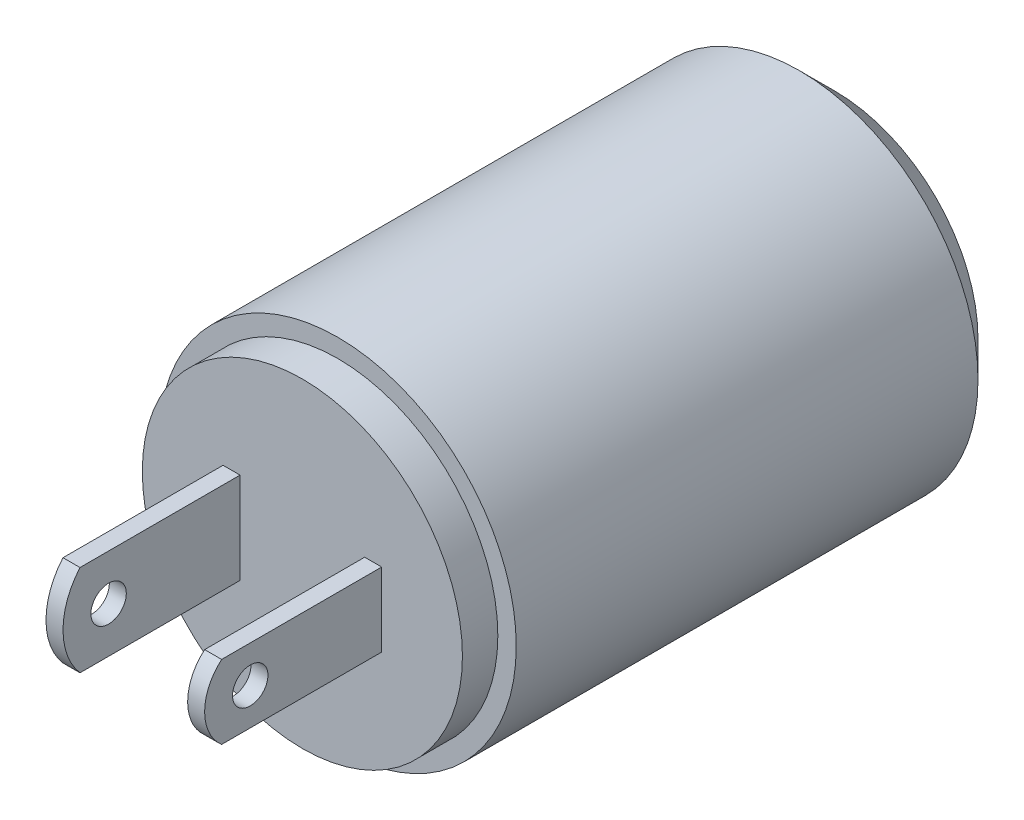
ISO-10303-21;
HEADER;
FILE_DESCRIPTION(('STEP AP214'),'2;1');
FILE_NAME('part.step','',(''),(''),'','','');
FILE_SCHEMA(('AUTOMOTIVE_DESIGN { 1 0 10303 214 1 1 1 1 }'));
ENDSEC;
DATA;
#1=APPLICATION_CONTEXT('core data for automotive mechanical design processes');
#2=APPLICATION_PROTOCOL_DEFINITION('international standard','automotive_design',2000,#1);
#3=PRODUCT_CONTEXT('',#1,'mechanical');
#4=PRODUCT('Part','Part','',(#3));
#5=PRODUCT_RELATED_PRODUCT_CATEGORY('part','',(#4));
#6=PRODUCT_DEFINITION_FORMATION('','',#4);
#7=PRODUCT_DEFINITION_CONTEXT('part definition',#1,'design');
#8=PRODUCT_DEFINITION('design','',#6,#7);
#9=PRODUCT_DEFINITION_SHAPE('','',#8);
#10=(LENGTH_UNIT() NAMED_UNIT(*) SI_UNIT(.MILLI.,.METRE.));
#11=(NAMED_UNIT(*) PLANE_ANGLE_UNIT() SI_UNIT($,.RADIAN.));
#12=(NAMED_UNIT(*) SI_UNIT($,.STERADIAN.) SOLID_ANGLE_UNIT());
#13=UNCERTAINTY_MEASURE_WITH_UNIT(LENGTH_MEASURE(1.E-05),#10,'distance_accuracy_value','');
#14=(GEOMETRIC_REPRESENTATION_CONTEXT(3) GLOBAL_UNCERTAINTY_ASSIGNED_CONTEXT((#13)) GLOBAL_UNIT_ASSIGNED_CONTEXT((#10,
#11,#12)) REPRESENTATION_CONTEXT('',''));
#15=CARTESIAN_POINT('',(0.,0.,0.));
#16=DIRECTION('',(0.,0.,1.));
#17=DIRECTION('',(1.,0.,0.));
#18=AXIS2_PLACEMENT_3D('',#15,#16,#17);
#19=CARTESIAN_POINT('',(0.,0.,0.));
#20=DIRECTION('',(0.,0.,-1.));
#21=DIRECTION('',(-1.,0.,0.));
#22=AXIS2_PLACEMENT_3D('',#19,#20,#21);
#23=PLANE('',#22);
#24=CARTESIAN_POINT('',(0.,0.,0.));
#25=DIRECTION('',(0.,0.,1.));
#26=DIRECTION('',(1.,0.,0.));
#27=AXIS2_PLACEMENT_3D('',#24,#25,#26);
#28=CIRCLE('',#27,14.351);
#29=CARTESIAN_POINT('',(14.351,0.,0.));
#30=VERTEX_POINT('',#29);
#31=EDGE_CURVE('P0_E9',#30,#30,#28,.T.);
#32=ORIENTED_EDGE('',*,*,#31,.T.);
#33=EDGE_LOOP('',(#32));
#34=FACE_BOUND('',#33,.T.);
#35=ADVANCED_FACE('P0_F14',(#34),#23,.F.);
#36=CARTESIAN_POINT('',(0.,0.,0.));
#37=DIRECTION('',(0.,0.,1.));
#38=DIRECTION('',(1.,0.,0.));
#39=AXIS2_PLACEMENT_3D('',#36,#37,#38);
#40=CYLINDRICAL_SURFACE('',#39,14.351);
#41=ORIENTED_EDGE('',*,*,#31,.F.);
#42=EDGE_LOOP('',(#41));
#43=FACE_BOUND('',#42,.T.);
#44=CARTESIAN_POINT('',(0.,0.,-3.175));
#45=DIRECTION('',(0.,0.,1.));
#46=DIRECTION('',(1.,0.,0.));
#47=AXIS2_PLACEMENT_3D('',#44,#45,#46);
#48=CIRCLE('',#47,14.351);
#49=CARTESIAN_POINT('',(14.351,0.,-3.175));
#50=VERTEX_POINT('',#49);
#51=EDGE_CURVE('P0_E20',#50,#50,#48,.T.);
#52=ORIENTED_EDGE('',*,*,#51,.T.);
#53=EDGE_LOOP('',(#52));
#54=FACE_BOUND('',#53,.T.);
#55=ADVANCED_FACE('P0_F51',(#43,#54),#40,.T.);
#56=CARTESIAN_POINT('',(0.,14.351,-3.175));
#57=DIRECTION('',(0.,0.,-1.));
#58=DIRECTION('',(-1.,0.,0.));
#59=AXIS2_PLACEMENT_3D('',#56,#57,#58);
#60=PLANE('',#59);
#61=ORIENTED_EDGE('',*,*,#51,.F.);
#62=EDGE_LOOP('',(#61));
#63=FACE_BOUND('',#62,.T.);
#64=CARTESIAN_POINT('',(0.,0.,-3.175));
#65=DIRECTION('',(0.,0.,1.));
#66=DIRECTION('',(1.,0.,0.));
#67=AXIS2_PLACEMENT_3D('',#64,#65,#66);
#68=CIRCLE('',#67,16.002);
#69=CARTESIAN_POINT('',(16.002,0.,-3.175));
#70=VERTEX_POINT('',#69);
#71=EDGE_CURVE('P0_E24',#70,#70,#68,.T.);
#72=ORIENTED_EDGE('',*,*,#71,.T.);
#73=EDGE_LOOP('',(#72));
#74=FACE_BOUND('',#73,.T.);
#75=ADVANCED_FACE('P0_F56',(#63,#74),#60,.F.);
#76=CARTESIAN_POINT('',(0.,0.,0.));
#77=DIRECTION('',(0.,0.,1.));
#78=DIRECTION('',(1.,0.,0.));
#79=AXIS2_PLACEMENT_3D('',#76,#77,#78);
#80=CYLINDRICAL_SURFACE('',#79,16.002);
#81=ORIENTED_EDGE('',*,*,#71,.F.);
#82=EDGE_LOOP('',(#81));
#83=FACE_BOUND('',#82,.T.);
#84=CARTESIAN_POINT('',(0.,0.,-44.577));
#85=DIRECTION('',(0.,0.,1.));
#86=DIRECTION('',(1.,0.,0.));
#87=AXIS2_PLACEMENT_3D('',#84,#85,#86);
#88=CIRCLE('',#87,16.002);
#89=CARTESIAN_POINT('',(16.002,0.,-44.577));
#90=VERTEX_POINT('',#89);
#91=EDGE_CURVE('P0_E28',#90,#90,#88,.T.);
#92=ORIENTED_EDGE('',*,*,#91,.T.);
#93=EDGE_LOOP('',(#92));
#94=FACE_BOUND('',#93,.T.);
#95=ADVANCED_FACE('P0_F47',(#83,#94),#80,.T.);
#96=CARTESIAN_POINT('',(0.,0.,-47.752));
#97=DIRECTION('',(0.,0.,1.));
#98=DIRECTION('',(1.,0.,0.));
#99=AXIS2_PLACEMENT_3D('',#96,#97,#98);
#100=CONICAL_SURFACE('',#99,12.827,0.785398163397449);
#101=ORIENTED_EDGE('',*,*,#91,.F.);
#102=EDGE_LOOP('',(#101));
#103=FACE_BOUND('',#102,.T.);
#104=CARTESIAN_POINT('',(0.,0.,-47.752));
#105=DIRECTION('',(0.,0.,1.));
#106=DIRECTION('',(1.,0.,0.));
#107=AXIS2_PLACEMENT_3D('',#104,#105,#106);
#108=CIRCLE('',#107,12.827);
#109=CARTESIAN_POINT('',(12.827,0.,-47.752));
#110=VERTEX_POINT('',#109);
#111=EDGE_CURVE('P0_E33',#110,#110,#108,.T.);
#112=ORIENTED_EDGE('',*,*,#111,.T.);
#113=EDGE_LOOP('',(#112));
#114=FACE_BOUND('',#113,.T.);
#115=ADVANCED_FACE('P0_F37',(#103,#114),#100,.T.);
#116=CARTESIAN_POINT('',(0.,0.,-47.752));
#117=DIRECTION('',(0.,0.,1.));
#118=DIRECTION('',(1.,0.,0.));
#119=AXIS2_PLACEMENT_3D('',#116,#117,#118);
#120=PLANE('',#119);
#121=ORIENTED_EDGE('',*,*,#111,.F.);
#122=EDGE_LOOP('',(#121));
#123=FACE_BOUND('',#122,.T.);
#124=ADVANCED_FACE('P0_F39',(#123),#120,.F.);
#125=CLOSED_SHELL('',(#35,#55,#75,#95,#115,#124));
#126=MANIFOLD_SOLID_BREP('P0_B1',#125);
#127=CARTESIAN_POINT('',(-7.112,4.0894,15.875));
#128=DIRECTION('',(0.,-1.,0.));
#129=DIRECTION('',(0.,0.,-1.));
#130=AXIS2_PLACEMENT_3D('',#127,#128,#129);
#131=PLANE('',#130);
#132=DIRECTION('',(0.,0.,-1.));
#133=VECTOR('',#132,1.);
#134=CARTESIAN_POINT('',(-7.112,4.0894,15.875));
#135=LINE('',#134,#133);
#136=CARTESIAN_POINT('',(-7.112,4.0894,14.351));
#137=VERTEX_POINT('',#136);
#138=CARTESIAN_POINT('',(-7.112,4.0894,0.));
#139=VERTEX_POINT('',#138);
#140=EDGE_CURVE('P1_E11',#137,#139,#135,.T.);
#141=ORIENTED_EDGE('',*,*,#140,.F.);
#142=DIRECTION('',(1.,0.,0.));
#143=VECTOR('',#142,1.);
#144=CARTESIAN_POINT('',(-7.112,4.0894,14.351));
#145=LINE('',#144,#143);
#146=CARTESIAN_POINT('',(-5.588,4.0894,14.351));
#147=VERTEX_POINT('',#146);
#148=EDGE_CURVE('P1_E67',#137,#147,#145,.T.);
#149=ORIENTED_EDGE('',*,*,#148,.T.);
#150=DIRECTION('',(0.,0.,-1.));
#151=VECTOR('',#150,1.);
#152=CARTESIAN_POINT('',(-5.588,4.0894,15.875));
#153=LINE('',#152,#151);
#154=CARTESIAN_POINT('',(-5.588,4.0894,0.));
#155=VERTEX_POINT('',#154);
#156=EDGE_CURVE('P1_E32',#147,#155,#153,.T.);
#157=ORIENTED_EDGE('',*,*,#156,.T.);
#158=DIRECTION('',(-1.,0.,0.));
#159=VECTOR('',#158,1.);
#160=CARTESIAN_POINT('',(-7.112,4.0894,0.));
#161=LINE('',#160,#159);
#162=EDGE_CURVE('P1_E74',#155,#139,#161,.T.);
#163=ORIENTED_EDGE('',*,*,#162,.T.);
#164=EDGE_LOOP('',(#141,#149,#157,#163));
#165=FACE_BOUND('',#164,.T.);
#166=ADVANCED_FACE('P1_F17',(#165),#131,.F.);
#167=CARTESIAN_POINT('',(-7.112,4.0894,15.875));
#168=DIRECTION('',(1.,0.,0.));
#169=DIRECTION('',(0.,0.,-1.));
#170=AXIS2_PLACEMENT_3D('',#167,#168,#169);
#171=PLANE('',#170);
#172=CARTESIAN_POINT('',(-7.112,0.,11.7856));
#173=DIRECTION('',(1.,0.,0.));
#174=DIRECTION('',(0.,0.,-1.));
#175=AXIS2_PLACEMENT_3D('',#172,#173,#174);
#176=CIRCLE('',#175,1.5875);
#177=CARTESIAN_POINT('',(-7.112,0.,10.1981));
#178=VERTEX_POINT('',#177);
#179=EDGE_CURVE('P1_E82',#178,#178,#176,.T.);
#180=ORIENTED_EDGE('',*,*,#179,.T.);
#181=EDGE_LOOP('',(#180));
#182=FACE_BOUND('',#181,.T.);
#183=DIRECTION('',(0.,0.,-1.));
#184=VECTOR('',#183,1.);
#185=CARTESIAN_POINT('',(-7.112,-4.0894,15.875));
#186=LINE('',#185,#184);
#187=CARTESIAN_POINT('',(-7.112,-4.0894,14.351));
#188=VERTEX_POINT('',#187);
#189=CARTESIAN_POINT('',(-7.112,-4.0894,0.));
#190=VERTEX_POINT('',#189);
#191=EDGE_CURVE('P1_E25',#188,#190,#186,.T.);
#192=ORIENTED_EDGE('',*,*,#191,.F.);
#193=CARTESIAN_POINT('',(-7.112,0.,9.62638833333333));
#194=DIRECTION('',(-1.,0.,0.));
#195=DIRECTION('',(0.,0.,-1.));
#196=AXIS2_PLACEMENT_3D('',#193,#194,#195);
#197=CIRCLE('',#196,6.24861166666667);
#198=EDGE_CURVE('P1_E59',#188,#137,#197,.T.);
#199=ORIENTED_EDGE('',*,*,#198,.T.);
#200=ORIENTED_EDGE('',*,*,#140,.T.);
#201=DIRECTION('',(0.,-1.,0.));
#202=VECTOR('',#201,1.);
#203=CARTESIAN_POINT('',(-7.112,4.0894,0.));
#204=LINE('',#203,#202);
#205=EDGE_CURVE('P1_E77',#139,#190,#204,.T.);
#206=ORIENTED_EDGE('',*,*,#205,.T.);
#207=EDGE_LOOP('',(#192,#199,#200,#206));
#208=FACE_BOUND('',#207,.T.);
#209=ADVANCED_FACE('P1_F61',(#182,#208),#171,.F.);
#210=CARTESIAN_POINT('',(-7.112,-4.0894,15.875));
#211=DIRECTION('',(0.,1.,0.));
#212=DIRECTION('',(0.,0.,1.));
#213=AXIS2_PLACEMENT_3D('',#210,#211,#212);
#214=PLANE('',#213);
#215=DIRECTION('',(0.,0.,-1.));
#216=VECTOR('',#215,1.);
#217=CARTESIAN_POINT('',(-5.588,-4.0894,15.875));
#218=LINE('',#217,#216);
#219=CARTESIAN_POINT('',(-5.588,-4.0894,14.351));
#220=VERTEX_POINT('',#219);
#221=CARTESIAN_POINT('',(-5.588,-4.0894,0.));
#222=VERTEX_POINT('',#221);
#223=EDGE_CURVE('P1_E39',#220,#222,#218,.T.);
#224=ORIENTED_EDGE('',*,*,#223,.F.);
#225=DIRECTION('',(1.,0.,0.));
#226=VECTOR('',#225,1.);
#227=CARTESIAN_POINT('',(-7.112,-4.0894,14.351));
#228=LINE('',#227,#226);
#229=EDGE_CURVE('P1_E71',#188,#220,#228,.T.);
#230=ORIENTED_EDGE('',*,*,#229,.F.);
#231=ORIENTED_EDGE('',*,*,#191,.T.);
#232=DIRECTION('',(1.,0.,0.));
#233=VECTOR('',#232,1.);
#234=CARTESIAN_POINT('',(-7.112,-4.0894,0.));
#235=LINE('',#234,#233);
#236=EDGE_CURVE('P1_E79',#190,#222,#235,.T.);
#237=ORIENTED_EDGE('',*,*,#236,.T.);
#238=EDGE_LOOP('',(#224,#230,#231,#237));
#239=FACE_BOUND('',#238,.T.);
#240=ADVANCED_FACE('P1_F92',(#239),#214,.F.);
#241=CARTESIAN_POINT('',(-5.588,4.0894,15.875));
#242=DIRECTION('',(-1.,0.,0.));
#243=DIRECTION('',(0.,0.,1.));
#244=AXIS2_PLACEMENT_3D('',#241,#242,#243);
#245=PLANE('',#244);
#246=CARTESIAN_POINT('',(-5.588,0.,11.7856));
#247=DIRECTION('',(-1.,0.,0.));
#248=DIRECTION('',(0.,0.,1.));
#249=AXIS2_PLACEMENT_3D('',#246,#247,#248);
#250=CIRCLE('',#249,1.5875);
#251=CARTESIAN_POINT('',(-5.588,0.,10.1981));
#252=VERTEX_POINT('',#251);
#253=EDGE_CURVE('P1_E20',#252,#252,#250,.T.);
#254=ORIENTED_EDGE('',*,*,#253,.T.);
#255=EDGE_LOOP('',(#254));
#256=FACE_BOUND('',#255,.T.);
#257=ORIENTED_EDGE('',*,*,#156,.F.);
#258=CARTESIAN_POINT('',(-5.588,0.,9.62638833333333));
#259=DIRECTION('',(-1.,0.,0.));
#260=DIRECTION('',(0.,0.,1.));
#261=AXIS2_PLACEMENT_3D('',#258,#259,#260);
#262=CIRCLE('',#261,6.24861166666667);
#263=EDGE_CURVE('P1_E70',#147,#220,#262,.F.);
#264=ORIENTED_EDGE('',*,*,#263,.T.);
#265=ORIENTED_EDGE('',*,*,#223,.T.);
#266=DIRECTION('',(0.,1.,0.));
#267=VECTOR('',#266,1.);
#268=CARTESIAN_POINT('',(-5.588,4.0894,0.));
#269=LINE('',#268,#267);
#270=EDGE_CURVE('P1_E87',#222,#155,#269,.T.);
#271=ORIENTED_EDGE('',*,*,#270,.T.);
#272=EDGE_LOOP('',(#257,#264,#265,#271));
#273=FACE_BOUND('',#272,.T.);
#274=ADVANCED_FACE('P1_F95',(#256,#273),#245,.F.);
#275=CARTESIAN_POINT('',(-5.588,4.0894,0.));
#276=DIRECTION('',(0.,0.,-1.));
#277=DIRECTION('',(-1.,0.,0.));
#278=AXIS2_PLACEMENT_3D('',#275,#276,#277);
#279=PLANE('',#278);
#280=ORIENTED_EDGE('',*,*,#162,.F.);
#281=ORIENTED_EDGE('',*,*,#270,.F.);
#282=ORIENTED_EDGE('',*,*,#236,.F.);
#283=ORIENTED_EDGE('',*,*,#205,.F.);
#284=EDGE_LOOP('',(#280,#281,#282,#283));
#285=FACE_BOUND('',#284,.T.);
#286=ADVANCED_FACE('P1_F94',(#285),#279,.T.);
#287=CARTESIAN_POINT('',(-7.112,0.,11.7856));
#288=DIRECTION('',(1.,0.,0.));
#289=DIRECTION('',(0.,0.,-1.));
#290=AXIS2_PLACEMENT_3D('',#287,#288,#289);
#291=CYLINDRICAL_SURFACE('',#290,1.5875);
#292=CARTESIAN_POINT('',(-7.112,0.,10.1981));
#293=CARTESIAN_POINT('',(-7.096125,0.,10.1981));
#294=CARTESIAN_POINT('',(-7.08025,0.,10.1981));
#295=CARTESIAN_POINT('',(-7.0485,0.,10.1981));
#296=CARTESIAN_POINT('',(-7.032625,0.,10.1981));
#297=CARTESIAN_POINT('',(-7.000875,0.,10.1981));
#298=CARTESIAN_POINT('',(-6.985,0.,10.1981));
#299=CARTESIAN_POINT('',(-6.95325,0.,10.1981));
#300=CARTESIAN_POINT('',(-6.937375,0.,10.1981));
#301=CARTESIAN_POINT('',(-6.905625,0.,10.1981));
#302=CARTESIAN_POINT('',(-6.88975,0.,10.1981));
#303=CARTESIAN_POINT('',(-6.858,0.,10.1981));
#304=CARTESIAN_POINT('',(-6.842125,0.,10.1981));
#305=CARTESIAN_POINT('',(-6.810375,0.,10.1981));
#306=CARTESIAN_POINT('',(-6.7945,0.,10.1981));
#307=CARTESIAN_POINT('',(-6.76275,0.,10.1981));
#308=CARTESIAN_POINT('',(-6.746875,0.,10.1981));
#309=CARTESIAN_POINT('',(-6.715125,0.,10.1981));
#310=CARTESIAN_POINT('',(-6.69925,0.,10.1981));
#311=CARTESIAN_POINT('',(-6.6675,0.,10.1981));
#312=CARTESIAN_POINT('',(-6.651625,0.,10.1981));
#313=CARTESIAN_POINT('',(-6.619875,0.,10.1981));
#314=CARTESIAN_POINT('',(-6.604,0.,10.1981));
#315=CARTESIAN_POINT('',(-6.57225,0.,10.1981));
#316=CARTESIAN_POINT('',(-6.556375,0.,10.1981));
#317=CARTESIAN_POINT('',(-6.524625,0.,10.1981));
#318=CARTESIAN_POINT('',(-6.50875,0.,10.1981));
#319=CARTESIAN_POINT('',(-6.477,0.,10.1981));
#320=CARTESIAN_POINT('',(-6.461125,0.,10.1981));
#321=CARTESIAN_POINT('',(-6.429375,0.,10.1981));
#322=CARTESIAN_POINT('',(-6.4135,0.,10.1981));
#323=CARTESIAN_POINT('',(-6.38175,0.,10.1981));
#324=CARTESIAN_POINT('',(-6.365875,0.,10.1981));
#325=CARTESIAN_POINT('',(-6.334125,0.,10.1981));
#326=CARTESIAN_POINT('',(-6.31825,0.,10.1981));
#327=CARTESIAN_POINT('',(-6.2865,0.,10.1981));
#328=CARTESIAN_POINT('',(-6.270625,0.,10.1981));
#329=CARTESIAN_POINT('',(-6.238875,0.,10.1981));
#330=CARTESIAN_POINT('',(-6.223,0.,10.1981));
#331=CARTESIAN_POINT('',(-6.19125,0.,10.1981));
#332=CARTESIAN_POINT('',(-6.175375,0.,10.1981));
#333=CARTESIAN_POINT('',(-6.143625,0.,10.1981));
#334=CARTESIAN_POINT('',(-6.12775,0.,10.1981));
#335=CARTESIAN_POINT('',(-6.096,0.,10.1981));
#336=CARTESIAN_POINT('',(-6.080125,0.,10.1981));
#337=CARTESIAN_POINT('',(-6.048375,0.,10.1981));
#338=CARTESIAN_POINT('',(-6.0325,0.,10.1981));
#339=CARTESIAN_POINT('',(-6.00075,0.,10.1981));
#340=CARTESIAN_POINT('',(-5.984875,0.,10.1981));
#341=CARTESIAN_POINT('',(-5.953125,0.,10.1981));
#342=CARTESIAN_POINT('',(-5.93725,0.,10.1981));
#343=CARTESIAN_POINT('',(-5.9055,0.,10.1981));
#344=CARTESIAN_POINT('',(-5.889625,0.,10.1981));
#345=CARTESIAN_POINT('',(-5.857875,0.,10.1981));
#346=CARTESIAN_POINT('',(-5.842,0.,10.1981));
#347=CARTESIAN_POINT('',(-5.81025,0.,10.1981));
#348=CARTESIAN_POINT('',(-5.794375,0.,10.1981));
#349=CARTESIAN_POINT('',(-5.762625,0.,10.1981));
#350=CARTESIAN_POINT('',(-5.74675,0.,10.1981));
#351=CARTESIAN_POINT('',(-5.715,0.,10.1981));
#352=CARTESIAN_POINT('',(-5.699125,0.,10.1981));
#353=CARTESIAN_POINT('',(-5.667375,0.,10.1981));
#354=CARTESIAN_POINT('',(-5.6515,0.,10.1981));
#355=CARTESIAN_POINT('',(-5.61975,0.,10.1981));
#356=CARTESIAN_POINT('',(-5.603875,0.,10.1981));
#357=CARTESIAN_POINT('',(-5.588,0.,10.1981));
#358=B_SPLINE_CURVE_WITH_KNOTS('',3,(#292,#293,#294,#295,#296,#297,#298,#299,#300,#301,#302,
#303,#304,#305,#306,#307,#308,#309,#310,#311,#312,#313,#314,#315,#316,#317,#318,#319,#320,#321,
#322,#323,#324,#325,#326,#327,#328,#329,#330,#331,#332,#333,#334,#335,#336,#337,#338,#339,#340,
#341,#342,#343,#344,#345,#346,#347,#348,#349,#350,#351,#352,#353,#354,#355,#356,#357),
.UNSPECIFIED.,.F.,.F.,(4,2,2,2,2,2,2,2,2,2,2,2,2,2,2,2,2,2,2,2,2,2,2,2,2,2,2,2,2,2,2,2,4),(0.,
0.0476250000000008,0.0952500000000007,0.142875000000001,0.190500000000001,0.238125,0.28575,
0.333375,0.381,0.428625,0.47625,0.523875,0.5715,0.619125,0.66675,0.714375,0.762,0.809625,
0.85725,0.904874999999999,0.952499999999999,1.000125,1.04775,1.095375,1.143,1.190625,1.23825,
1.285875,1.3335,1.381125,1.42875,1.476375,1.524),.UNSPECIFIED.);
#359=EDGE_CURVE('P1_BSEAM101',#178,#252,#358,.T.);
#360=ORIENTED_EDGE('',*,*,#179,.F.);
#361=ORIENTED_EDGE('',*,*,#253,.F.);
#362=ORIENTED_EDGE('',*,*,#359,.T.);
#363=ORIENTED_EDGE('',*,*,#359,.F.);
#364=EDGE_LOOP('',(#360,#362,#361,#363));
#365=FACE_BOUND('',#364,.T.);
#366=ADVANCED_FACE('P1_F101',(#365),#291,.F.);
#367=CARTESIAN_POINT('',(-7.112,0.,9.62638833333333));
#368=DIRECTION('',(1.,0.,0.));
#369=DIRECTION('',(0.,0.,-1.));
#370=AXIS2_PLACEMENT_3D('',#367,#368,#369);
#371=CYLINDRICAL_SURFACE('',#370,6.24861166666667);
#372=ORIENTED_EDGE('',*,*,#263,.F.);
#373=ORIENTED_EDGE('',*,*,#148,.F.);
#374=ORIENTED_EDGE('',*,*,#198,.F.);
#375=ORIENTED_EDGE('',*,*,#229,.T.);
#376=EDGE_LOOP('',(#372,#373,#374,#375));
#377=FACE_BOUND('',#376,.T.);
#378=ADVANCED_FACE('P1_F69',(#377),#371,.T.);
#379=CLOSED_SHELL('',(#166,#209,#240,#274,#286,#366,#378));
#380=MANIFOLD_SOLID_BREP('P1_B1',#379);
#381=CARTESIAN_POINT('',(5.588,3.302,15.875));
#382=DIRECTION('',(1.,0.,0.));
#383=DIRECTION('',(0.,1.,0.));
#384=AXIS2_PLACEMENT_3D('',#381,#382,#383);
#385=PLANE('',#384);
#386=CARTESIAN_POINT('',(5.588,0.,11.7856));
#387=DIRECTION('',(1.,0.,0.));
#388=DIRECTION('',(0.,1.,0.));
#389=AXIS2_PLACEMENT_3D('',#386,#387,#388);
#390=CIRCLE('',#389,1.5875);
#391=CARTESIAN_POINT('',(5.588,0.,13.3731));
#392=VERTEX_POINT('',#391);
#393=EDGE_CURVE('P2_E91',#392,#392,#390,.F.);
#394=ORIENTED_EDGE('',*,*,#393,.F.);
#395=EDGE_LOOP('',(#394));
#396=FACE_BOUND('',#395,.T.);
#397=CARTESIAN_POINT('',(5.588,0.,11.5358333333333));
#398=DIRECTION('',(1.,0.,0.));
#399=DIRECTION('',(0.,1.,0.));
#400=AXIS2_PLACEMENT_3D('',#397,#398,#399);
#401=CIRCLE('',#400,4.33916666666666);
#402=CARTESIAN_POINT('',(5.588,3.302,14.351));
#403=VERTEX_POINT('',#402);
#404=CARTESIAN_POINT('',(5.588,-3.302,14.351));
#405=VERTEX_POINT('',#404);
#406=EDGE_CURVE('P2_E32',#403,#405,#401,.T.);
#407=ORIENTED_EDGE('',*,*,#406,.F.);
#408=DIRECTION('',(0.,0.,-1.));
#409=VECTOR('',#408,1.);
#410=CARTESIAN_POINT('',(5.588,3.302,15.875));
#411=LINE('',#410,#409);
#412=CARTESIAN_POINT('',(5.588,3.302,0.));
#413=VERTEX_POINT('',#412);
#414=EDGE_CURVE('P2_E11',#403,#413,#411,.T.);
#415=ORIENTED_EDGE('',*,*,#414,.T.);
#416=DIRECTION('',(0.,-1.,0.));
#417=VECTOR('',#416,1.);
#418=CARTESIAN_POINT('',(5.588,3.302,0.));
#419=LINE('',#418,#417);
#420=CARTESIAN_POINT('',(5.588,-3.302,0.));
#421=VERTEX_POINT('',#420);
#422=EDGE_CURVE('P2_E84',#413,#421,#419,.T.);
#423=ORIENTED_EDGE('',*,*,#422,.T.);
#424=DIRECTION('',(0.,0.,-1.));
#425=VECTOR('',#424,1.);
#426=CARTESIAN_POINT('',(5.588,-3.302,15.875));
#427=LINE('',#426,#425);
#428=EDGE_CURVE('P2_E25',#405,#421,#427,.T.);
#429=ORIENTED_EDGE('',*,*,#428,.F.);
#430=EDGE_LOOP('',(#407,#415,#423,#429));
#431=FACE_BOUND('',#430,.T.);
#432=ADVANCED_FACE('P2_F17',(#396,#431),#385,.F.);
#433=CARTESIAN_POINT('',(7.112,3.302,15.875));
#434=DIRECTION('',(-1.,0.,0.));
#435=DIRECTION('',(0.,-1.,0.));
#436=AXIS2_PLACEMENT_3D('',#433,#434,#435);
#437=PLANE('',#436);
#438=CARTESIAN_POINT('',(7.112,0.,11.7856));
#439=DIRECTION('',(1.,0.,0.));
#440=DIRECTION('',(0.,0.,-1.));
#441=AXIS2_PLACEMENT_3D('',#438,#439,#440);
#442=CIRCLE('',#441,1.5875);
#443=CARTESIAN_POINT('',(7.112,0.,13.3731));
#444=VERTEX_POINT('',#443);
#445=EDGE_CURVE('P2_E94',#444,#444,#442,.T.);
#446=ORIENTED_EDGE('',*,*,#445,.F.);
#447=EDGE_LOOP('',(#446));
#448=FACE_BOUND('',#447,.T.);
#449=CARTESIAN_POINT('',(7.112,0.,11.5358333333333));
#450=DIRECTION('',(-1.,0.,0.));
#451=DIRECTION('',(0.,0.,-1.));
#452=AXIS2_PLACEMENT_3D('',#449,#450,#451);
#453=CIRCLE('',#452,4.33916666666666);
#454=CARTESIAN_POINT('',(7.112,-3.302,14.351));
#455=VERTEX_POINT('',#454);
#456=CARTESIAN_POINT('',(7.112,3.302,14.351));
#457=VERTEX_POINT('',#456);
#458=EDGE_CURVE('P2_E57',#455,#457,#453,.T.);
#459=ORIENTED_EDGE('',*,*,#458,.F.);
#460=DIRECTION('',(0.,0.,-1.));
#461=VECTOR('',#460,1.);
#462=CARTESIAN_POINT('',(7.112,-3.302,15.875));
#463=LINE('',#462,#461);
#464=CARTESIAN_POINT('',(7.112,-3.302,0.));
#465=VERTEX_POINT('',#464);
#466=EDGE_CURVE('P2_E70',#455,#465,#463,.T.);
#467=ORIENTED_EDGE('',*,*,#466,.T.);
#468=DIRECTION('',(0.,1.,0.));
#469=VECTOR('',#468,1.);
#470=CARTESIAN_POINT('',(7.112,3.302,0.));
#471=LINE('',#470,#469);
#472=CARTESIAN_POINT('',(7.112,3.302,0.));
#473=VERTEX_POINT('',#472);
#474=EDGE_CURVE('P2_E68',#465,#473,#471,.T.);
#475=ORIENTED_EDGE('',*,*,#474,.T.);
#476=DIRECTION('',(0.,0.,-1.));
#477=VECTOR('',#476,1.);
#478=CARTESIAN_POINT('',(7.112,3.302,15.875));
#479=LINE('',#478,#477);
#480=EDGE_CURVE('P2_E40',#457,#473,#479,.T.);
#481=ORIENTED_EDGE('',*,*,#480,.F.);
#482=EDGE_LOOP('',(#459,#467,#475,#481));
#483=FACE_BOUND('',#482,.T.);
#484=ADVANCED_FACE('P2_F66',(#448,#483),#437,.F.);
#485=CARTESIAN_POINT('',(7.112,3.302,15.875));
#486=DIRECTION('',(0.,-1.,0.));
#487=DIRECTION('',(0.,0.,-1.));
#488=AXIS2_PLACEMENT_3D('',#485,#486,#487);
#489=PLANE('',#488);
#490=DIRECTION('',(-1.,0.,0.));
#491=VECTOR('',#490,1.);
#492=CARTESIAN_POINT('',(7.112,3.302,14.351));
#493=LINE('',#492,#491);
#494=EDGE_CURVE('P2_E59',#457,#403,#493,.T.);
#495=ORIENTED_EDGE('',*,*,#494,.F.);
#496=ORIENTED_EDGE('',*,*,#480,.T.);
#497=DIRECTION('',(-1.,0.,0.));
#498=VECTOR('',#497,1.);
#499=CARTESIAN_POINT('',(7.112,3.302,0.));
#500=LINE('',#499,#498);
#501=EDGE_CURVE('P2_E86',#473,#413,#500,.T.);
#502=ORIENTED_EDGE('',*,*,#501,.T.);
#503=ORIENTED_EDGE('',*,*,#414,.F.);
#504=EDGE_LOOP('',(#495,#496,#502,#503));
#505=FACE_BOUND('',#504,.T.);
#506=ADVANCED_FACE('P2_F19',(#505),#489,.F.);
#507=CARTESIAN_POINT('',(7.112,-3.302,15.875));
#508=DIRECTION('',(0.,1.,0.));
#509=DIRECTION('',(0.,0.,1.));
#510=AXIS2_PLACEMENT_3D('',#507,#508,#509);
#511=PLANE('',#510);
#512=DIRECTION('',(-1.,0.,0.));
#513=VECTOR('',#512,1.);
#514=CARTESIAN_POINT('',(7.112,-3.302,14.351));
#515=LINE('',#514,#513);
#516=EDGE_CURVE('P2_E60',#455,#405,#515,.T.);
#517=ORIENTED_EDGE('',*,*,#516,.T.);
#518=ORIENTED_EDGE('',*,*,#428,.T.);
#519=DIRECTION('',(1.,0.,0.));
#520=VECTOR('',#519,1.);
#521=CARTESIAN_POINT('',(7.112,-3.302,0.));
#522=LINE('',#521,#520);
#523=EDGE_CURVE('P2_E73',#421,#465,#522,.T.);
#524=ORIENTED_EDGE('',*,*,#523,.T.);
#525=ORIENTED_EDGE('',*,*,#466,.F.);
#526=EDGE_LOOP('',(#517,#518,#524,#525));
#527=FACE_BOUND('',#526,.T.);
#528=ADVANCED_FACE('P2_F80',(#527),#511,.F.);
#529=CARTESIAN_POINT('',(5.588,3.302,0.));
#530=DIRECTION('',(0.,0.,1.));
#531=DIRECTION('',(1.,0.,0.));
#532=AXIS2_PLACEMENT_3D('',#529,#530,#531);
#533=PLANE('',#532);
#534=ORIENTED_EDGE('',*,*,#501,.F.);
#535=ORIENTED_EDGE('',*,*,#474,.F.);
#536=ORIENTED_EDGE('',*,*,#523,.F.);
#537=ORIENTED_EDGE('',*,*,#422,.F.);
#538=EDGE_LOOP('',(#534,#535,#536,#537));
#539=FACE_BOUND('',#538,.T.);
#540=ADVANCED_FACE('P2_F88',(#539),#533,.F.);
#541=CARTESIAN_POINT('',(7.112,0.,11.7856));
#542=DIRECTION('',(-1.,0.,0.));
#543=DIRECTION('',(0.,0.,1.));
#544=AXIS2_PLACEMENT_3D('',#541,#542,#543);
#545=CYLINDRICAL_SURFACE('',#544,1.5875);
#546=CARTESIAN_POINT('',(7.112,0.,13.3731));
#547=CARTESIAN_POINT('',(7.096125,0.,13.3731));
#548=CARTESIAN_POINT('',(7.08025,0.,13.3731));
#549=CARTESIAN_POINT('',(7.0485,0.,13.3731));
#550=CARTESIAN_POINT('',(7.032625,0.,13.3731));
#551=CARTESIAN_POINT('',(7.000875,0.,13.3731));
#552=CARTESIAN_POINT('',(6.985,0.,13.3731));
#553=CARTESIAN_POINT('',(6.95325,0.,13.3731));
#554=CARTESIAN_POINT('',(6.937375,0.,13.3731));
#555=CARTESIAN_POINT('',(6.905625,0.,13.3731));
#556=CARTESIAN_POINT('',(6.88975,0.,13.3731));
#557=CARTESIAN_POINT('',(6.858,0.,13.3731));
#558=CARTESIAN_POINT('',(6.842125,0.,13.3731));
#559=CARTESIAN_POINT('',(6.810375,0.,13.3731));
#560=CARTESIAN_POINT('',(6.7945,0.,13.3731));
#561=CARTESIAN_POINT('',(6.76275,0.,13.3731));
#562=CARTESIAN_POINT('',(6.746875,0.,13.3731));
#563=CARTESIAN_POINT('',(6.715125,0.,13.3731));
#564=CARTESIAN_POINT('',(6.69925,0.,13.3731));
#565=CARTESIAN_POINT('',(6.6675,0.,13.3731));
#566=CARTESIAN_POINT('',(6.651625,0.,13.3731));
#567=CARTESIAN_POINT('',(6.619875,0.,13.3731));
#568=CARTESIAN_POINT('',(6.604,0.,13.3731));
#569=CARTESIAN_POINT('',(6.57225,0.,13.3731));
#570=CARTESIAN_POINT('',(6.556375,0.,13.3731));
#571=CARTESIAN_POINT('',(6.524625,0.,13.3731));
#572=CARTESIAN_POINT('',(6.50875,0.,13.3731));
#573=CARTESIAN_POINT('',(6.477,0.,13.3731));
#574=CARTESIAN_POINT('',(6.461125,0.,13.3731));
#575=CARTESIAN_POINT('',(6.429375,0.,13.3731));
#576=CARTESIAN_POINT('',(6.4135,0.,13.3731));
#577=CARTESIAN_POINT('',(6.38175,0.,13.3731));
#578=CARTESIAN_POINT('',(6.365875,0.,13.3731));
#579=CARTESIAN_POINT('',(6.334125,0.,13.3731));
#580=CARTESIAN_POINT('',(6.31825,0.,13.3731));
#581=CARTESIAN_POINT('',(6.2865,0.,13.3731));
#582=CARTESIAN_POINT('',(6.270625,0.,13.3731));
#583=CARTESIAN_POINT('',(6.238875,0.,13.3731));
#584=CARTESIAN_POINT('',(6.223,0.,13.3731));
#585=CARTESIAN_POINT('',(6.19125,0.,13.3731));
#586=CARTESIAN_POINT('',(6.175375,0.,13.3731));
#587=CARTESIAN_POINT('',(6.143625,0.,13.3731));
#588=CARTESIAN_POINT('',(6.12775,0.,13.3731));
#589=CARTESIAN_POINT('',(6.096,0.,13.3731));
#590=CARTESIAN_POINT('',(6.080125,0.,13.3731));
#591=CARTESIAN_POINT('',(6.048375,0.,13.3731));
#592=CARTESIAN_POINT('',(6.0325,0.,13.3731));
#593=CARTESIAN_POINT('',(6.00075,0.,13.3731));
#594=CARTESIAN_POINT('',(5.984875,0.,13.3731));
#595=CARTESIAN_POINT('',(5.953125,0.,13.3731));
#596=CARTESIAN_POINT('',(5.93725,0.,13.3731));
#597=CARTESIAN_POINT('',(5.9055,0.,13.3731));
#598=CARTESIAN_POINT('',(5.889625,0.,13.3731));
#599=CARTESIAN_POINT('',(5.857875,0.,13.3731));
#600=CARTESIAN_POINT('',(5.842,0.,13.3731));
#601=CARTESIAN_POINT('',(5.81025,0.,13.3731));
#602=CARTESIAN_POINT('',(5.794375,0.,13.3731));
#603=CARTESIAN_POINT('',(5.762625,0.,13.3731));
#604=CARTESIAN_POINT('',(5.74675,0.,13.3731));
#605=CARTESIAN_POINT('',(5.715,0.,13.3731));
#606=CARTESIAN_POINT('',(5.699125,0.,13.3731));
#607=CARTESIAN_POINT('',(5.667375,0.,13.3731));
#608=CARTESIAN_POINT('',(5.6515,0.,13.3731));
#609=CARTESIAN_POINT('',(5.61975,0.,13.3731));
#610=CARTESIAN_POINT('',(5.603875,0.,13.3731));
#611=CARTESIAN_POINT('',(5.588,0.,13.3731));
#612=B_SPLINE_CURVE_WITH_KNOTS('',3,(#546,#547,#548,#549,#550,#551,#552,#553,#554,#555,#556,
#557,#558,#559,#560,#561,#562,#563,#564,#565,#566,#567,#568,#569,#570,#571,#572,#573,#574,#575,
#576,#577,#578,#579,#580,#581,#582,#583,#584,#585,#586,#587,#588,#589,#590,#591,#592,#593,#594,
#595,#596,#597,#598,#599,#600,#601,#602,#603,#604,#605,#606,#607,#608,#609,#610,#611),
.UNSPECIFIED.,.F.,.F.,(4,2,2,2,2,2,2,2,2,2,2,2,2,2,2,2,2,2,2,2,2,2,2,2,2,2,2,2,2,2,2,2,4),(0.,
0.0476249999999991,0.095249999999999,0.142874999999999,0.190499999999999,0.238124999999999,
0.285749999999999,0.333374999999999,0.380999999999999,0.428624999999998,0.476249999999998,
0.523874999999998,0.571499999999998,0.619124999999998,0.666749999999998,0.714374999999998,
0.761999999999998,0.809624999999998,0.857249999999998,0.904874999999998,0.952499999999998,
1.000125,1.04775,1.095375,1.143,1.190625,1.23825,1.285875,1.3335,1.381125,1.42875,1.476375,
1.524),.UNSPECIFIED.);
#613=EDGE_CURVE('P2_BSEAM100',#444,#392,#612,.T.);
#614=ORIENTED_EDGE('',*,*,#445,.T.);
#615=ORIENTED_EDGE('',*,*,#393,.T.);
#616=ORIENTED_EDGE('',*,*,#613,.T.);
#617=ORIENTED_EDGE('',*,*,#613,.F.);
#618=EDGE_LOOP('',(#614,#616,#615,#617));
#619=FACE_BOUND('',#618,.T.);
#620=ADVANCED_FACE('P2_F100',(#619),#545,.F.);
#621=CARTESIAN_POINT('',(7.112,0.,11.5358333333333));
#622=DIRECTION('',(-1.,0.,0.));
#623=DIRECTION('',(0.,0.,1.));
#624=AXIS2_PLACEMENT_3D('',#621,#622,#623);
#625=CYLINDRICAL_SURFACE('',#624,4.33916666666666);
#626=ORIENTED_EDGE('',*,*,#406,.T.);
#627=ORIENTED_EDGE('',*,*,#516,.F.);
#628=ORIENTED_EDGE('',*,*,#458,.T.);
#629=ORIENTED_EDGE('',*,*,#494,.T.);
#630=EDGE_LOOP('',(#626,#627,#628,#629));
#631=FACE_BOUND('',#630,.T.);
#632=ADVANCED_FACE('P2_F58',(#631),#625,.T.);
#633=CLOSED_SHELL('',(#432,#484,#506,#528,#540,#620,#632));
#634=MANIFOLD_SOLID_BREP('P2_B1',#633);
#635=ADVANCED_BREP_SHAPE_REPRESENTATION('',(#18,#126,#380,#634),#14);
#636=SHAPE_DEFINITION_REPRESENTATION(#9,#635);
ENDSEC;
END-ISO-10303-21;
